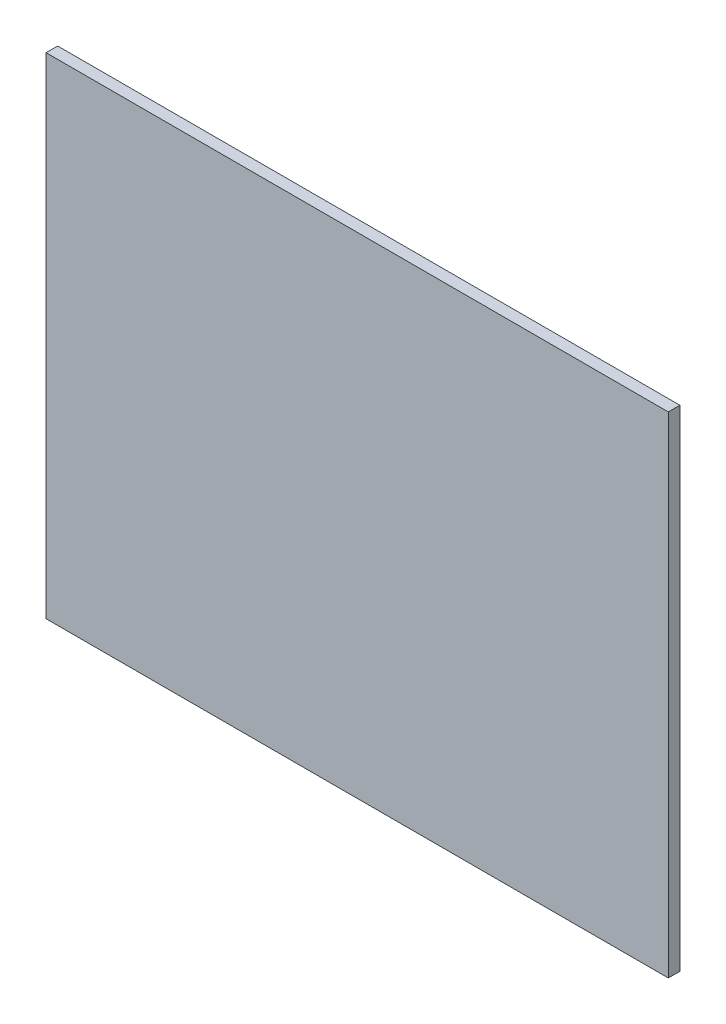
ISO-10303-21;
HEADER;
FILE_DESCRIPTION(('STEP AP214'),'2;1');
FILE_NAME('part.step','',(''),(''),'','','');
FILE_SCHEMA(('AUTOMOTIVE_DESIGN { 1 0 10303 214 1 1 1 1 }'));
ENDSEC;
DATA;
#1=APPLICATION_CONTEXT('core data for automotive mechanical design processes');
#2=APPLICATION_PROTOCOL_DEFINITION('international standard','automotive_design',2000,#1);
#3=PRODUCT_CONTEXT('',#1,'mechanical');
#4=PRODUCT('Part','Part','',(#3));
#5=PRODUCT_RELATED_PRODUCT_CATEGORY('part','',(#4));
#6=PRODUCT_DEFINITION_FORMATION('','',#4);
#7=PRODUCT_DEFINITION_CONTEXT('part definition',#1,'design');
#8=PRODUCT_DEFINITION('design','',#6,#7);
#9=PRODUCT_DEFINITION_SHAPE('','',#8);
#10=(LENGTH_UNIT() NAMED_UNIT(*) SI_UNIT(.MILLI.,.METRE.));
#11=(NAMED_UNIT(*) PLANE_ANGLE_UNIT() SI_UNIT($,.RADIAN.));
#12=(NAMED_UNIT(*) SI_UNIT($,.STERADIAN.) SOLID_ANGLE_UNIT());
#13=UNCERTAINTY_MEASURE_WITH_UNIT(LENGTH_MEASURE(1.E-05),#10,'distance_accuracy_value','');
#14=(GEOMETRIC_REPRESENTATION_CONTEXT(3) GLOBAL_UNCERTAINTY_ASSIGNED_CONTEXT((#13)) GLOBAL_UNIT_ASSIGNED_CONTEXT((#10,
#11,#12)) REPRESENTATION_CONTEXT('',''));
#15=CARTESIAN_POINT('',(0.,0.,0.));
#16=DIRECTION('',(0.,0.,1.));
#17=DIRECTION('',(1.,0.,0.));
#18=AXIS2_PLACEMENT_3D('',#15,#16,#17);
#19=CARTESIAN_POINT('',(19.4,-16.9,1.6));
#20=DIRECTION('',(0.,1.,0.));
#21=DIRECTION('',(-1.,0.,0.));
#22=AXIS2_PLACEMENT_3D('',#19,#20,#21);
#23=PLANE('',#22);
#24=DIRECTION('',(1.,0.,0.));
#25=VECTOR('',#24,1.);
#26=CARTESIAN_POINT('',(19.4,-16.9,0.8));
#27=LINE('',#26,#25);
#28=CARTESIAN_POINT('',(-23.5,-16.9,0.8));
#29=VERTEX_POINT('',#28);
#30=CARTESIAN_POINT('',(19.4,-16.9,0.8));
#31=VERTEX_POINT('',#30);
#32=EDGE_CURVE('E96',#29,#31,#27,.T.);
#33=ORIENTED_EDGE('',*,*,#32,.T.);
#34=DIRECTION('',(0.,0.,-1.));
#35=VECTOR('',#34,1.);
#36=CARTESIAN_POINT('',(19.4,-16.9,1.6));
#37=LINE('',#36,#35);
#38=CARTESIAN_POINT('',(19.4,-16.9,1.6));
#39=VERTEX_POINT('',#38);
#40=EDGE_CURVE('E11',#39,#31,#37,.T.);
#41=ORIENTED_EDGE('',*,*,#40,.F.);
#42=DIRECTION('',(1.,0.,0.));
#43=VECTOR('',#42,1.);
#44=CARTESIAN_POINT('',(19.4,-16.9,1.6));
#45=LINE('',#44,#43);
#46=CARTESIAN_POINT('',(-23.5,-16.9,1.6));
#47=VERTEX_POINT('',#46);
#48=EDGE_CURVE('E84',#47,#39,#45,.T.);
#49=ORIENTED_EDGE('',*,*,#48,.F.);
#50=DIRECTION('',(0.,0.,-1.));
#51=VECTOR('',#50,1.);
#52=CARTESIAN_POINT('',(-23.5,-16.9,1.6));
#53=LINE('',#52,#51);
#54=EDGE_CURVE('E92',#47,#29,#53,.T.);
#55=ORIENTED_EDGE('',*,*,#54,.T.);
#56=EDGE_LOOP('',(#33,#41,#49,#55));
#57=FACE_BOUND('',#56,.T.);
#58=ADVANCED_FACE('F33',(#57),#23,.F.);
#59=CARTESIAN_POINT('',(19.4,16.9,1.6));
#60=DIRECTION('',(-1.,0.,0.));
#61=DIRECTION('',(0.,-1.,0.));
#62=AXIS2_PLACEMENT_3D('',#59,#60,#61);
#63=PLANE('',#62);
#64=DIRECTION('',(0.,1.,0.));
#65=VECTOR('',#64,1.);
#66=CARTESIAN_POINT('',(19.4,16.9,0.8));
#67=LINE('',#66,#65);
#68=CARTESIAN_POINT('',(19.4,16.9,0.8));
#69=VERTEX_POINT('',#68);
#70=EDGE_CURVE('E88',#31,#69,#67,.T.);
#71=ORIENTED_EDGE('',*,*,#70,.T.);
#72=DIRECTION('',(0.,0.,-1.));
#73=VECTOR('',#72,1.);
#74=CARTESIAN_POINT('',(19.4,16.9,1.6));
#75=LINE('',#74,#73);
#76=CARTESIAN_POINT('',(19.4,16.9,1.6));
#77=VERTEX_POINT('',#76);
#78=EDGE_CURVE('E41',#77,#69,#75,.T.);
#79=ORIENTED_EDGE('',*,*,#78,.F.);
#80=DIRECTION('',(0.,1.,0.));
#81=VECTOR('',#80,1.);
#82=CARTESIAN_POINT('',(19.4,16.9,1.6));
#83=LINE('',#82,#81);
#84=EDGE_CURVE('E79',#39,#77,#83,.T.);
#85=ORIENTED_EDGE('',*,*,#84,.F.);
#86=ORIENTED_EDGE('',*,*,#40,.T.);
#87=EDGE_LOOP('',(#71,#79,#85,#86));
#88=FACE_BOUND('',#87,.T.);
#89=ADVANCED_FACE('F87',(#88),#63,.F.);
#90=CARTESIAN_POINT('',(-23.5,16.9,1.6));
#91=DIRECTION('',(0.,-1.,0.));
#92=DIRECTION('',(1.,0.,0.));
#93=AXIS2_PLACEMENT_3D('',#90,#91,#92);
#94=PLANE('',#93);
#95=DIRECTION('',(-1.,0.,0.));
#96=VECTOR('',#95,1.);
#97=CARTESIAN_POINT('',(-23.5,16.9,0.8));
#98=LINE('',#97,#96);
#99=CARTESIAN_POINT('',(-23.5,16.9,0.8));
#100=VERTEX_POINT('',#99);
#101=EDGE_CURVE('E66',#69,#100,#98,.T.);
#102=ORIENTED_EDGE('',*,*,#101,.T.);
#103=DIRECTION('',(0.,0.,-1.));
#104=VECTOR('',#103,1.);
#105=CARTESIAN_POINT('',(-23.5,16.9,1.6));
#106=LINE('',#105,#104);
#107=CARTESIAN_POINT('',(-23.5,16.9,1.6));
#108=VERTEX_POINT('',#107);
#109=EDGE_CURVE('E89',#108,#100,#106,.T.);
#110=ORIENTED_EDGE('',*,*,#109,.F.);
#111=DIRECTION('',(-1.,0.,0.));
#112=VECTOR('',#111,1.);
#113=CARTESIAN_POINT('',(-23.5,16.9,1.6));
#114=LINE('',#113,#112);
#115=EDGE_CURVE('E82',#77,#108,#114,.T.);
#116=ORIENTED_EDGE('',*,*,#115,.F.);
#117=ORIENTED_EDGE('',*,*,#78,.T.);
#118=EDGE_LOOP('',(#102,#110,#116,#117));
#119=FACE_BOUND('',#118,.T.);
#120=ADVANCED_FACE('F90',(#119),#94,.F.);
#121=CARTESIAN_POINT('',(-23.5,-16.9,1.6));
#122=DIRECTION('',(1.,0.,0.));
#123=DIRECTION('',(0.,1.,0.));
#124=AXIS2_PLACEMENT_3D('',#121,#122,#123);
#125=PLANE('',#124);
#126=DIRECTION('',(0.,-1.,0.));
#127=VECTOR('',#126,1.);
#128=CARTESIAN_POINT('',(-23.5,-16.9,0.8));
#129=LINE('',#128,#127);
#130=EDGE_CURVE('E72',#100,#29,#129,.T.);
#131=ORIENTED_EDGE('',*,*,#130,.T.);
#132=ORIENTED_EDGE('',*,*,#54,.F.);
#133=DIRECTION('',(0.,-1.,0.));
#134=VECTOR('',#133,1.);
#135=CARTESIAN_POINT('',(-23.5,-16.9,1.6));
#136=LINE('',#135,#134);
#137=EDGE_CURVE('E49',#108,#47,#136,.T.);
#138=ORIENTED_EDGE('',*,*,#137,.F.);
#139=ORIENTED_EDGE('',*,*,#109,.T.);
#140=EDGE_LOOP('',(#131,#132,#138,#139));
#141=FACE_BOUND('',#140,.T.);
#142=ADVANCED_FACE('F103',(#141),#125,.F.);
#143=CARTESIAN_POINT('',(0.,0.,1.6));
#144=DIRECTION('',(0.,0.,-1.));
#145=DIRECTION('',(-1.,0.,0.));
#146=AXIS2_PLACEMENT_3D('',#143,#144,#145);
#147=PLANE('',#146);
#148=ORIENTED_EDGE('',*,*,#48,.T.);
#149=ORIENTED_EDGE('',*,*,#84,.T.);
#150=ORIENTED_EDGE('',*,*,#115,.T.);
#151=ORIENTED_EDGE('',*,*,#137,.T.);
#152=EDGE_LOOP('',(#148,#149,#150,#151));
#153=FACE_BOUND('',#152,.T.);
#154=ADVANCED_FACE('F80',(#153),#147,.F.);
#155=CARTESIAN_POINT('',(0.,0.,0.8));
#156=DIRECTION('',(0.,0.,-1.));
#157=DIRECTION('',(-1.,0.,0.));
#158=AXIS2_PLACEMENT_3D('',#155,#156,#157);
#159=PLANE('',#158);
#160=ORIENTED_EDGE('',*,*,#32,.F.);
#161=ORIENTED_EDGE('',*,*,#130,.F.);
#162=ORIENTED_EDGE('',*,*,#101,.F.);
#163=ORIENTED_EDGE('',*,*,#70,.F.);
#164=EDGE_LOOP('',(#160,#161,#162,#163));
#165=FACE_BOUND('',#164,.T.);
#166=ADVANCED_FACE('F106',(#165),#159,.T.);
#167=CLOSED_SHELL('',(#58,#89,#120,#142,#154,#166));
#168=MANIFOLD_SOLID_BREP('B2',#167);
#169=ADVANCED_BREP_SHAPE_REPRESENTATION('',(#18,#168),#14);
#170=SHAPE_DEFINITION_REPRESENTATION(#9,#169);
ENDSEC;
END-ISO-10303-21;
